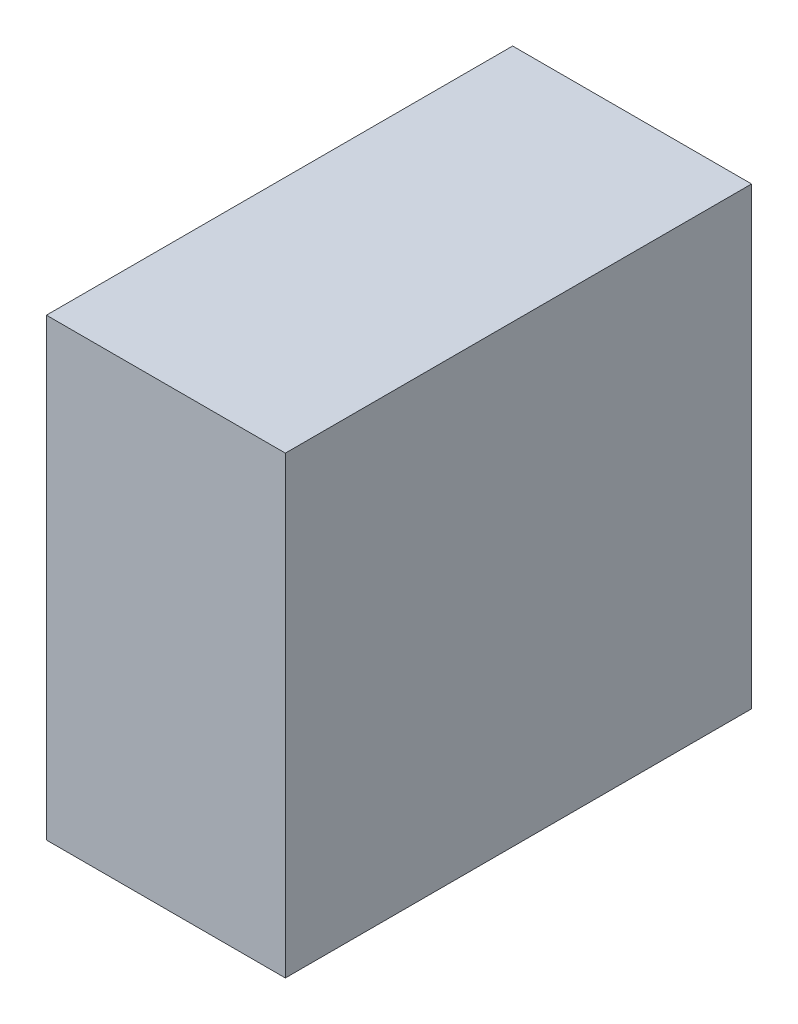
ISO-10303-21;
HEADER;
FILE_DESCRIPTION(('STEP AP214'),'2;1');
FILE_NAME('part.step','',(''),(''),'','','');
FILE_SCHEMA(('AUTOMOTIVE_DESIGN { 1 0 10303 214 1 1 1 1 }'));
ENDSEC;
DATA;
#1=APPLICATION_CONTEXT('core data for automotive mechanical design processes');
#2=APPLICATION_PROTOCOL_DEFINITION('international standard','automotive_design',2000,#1);
#3=PRODUCT_CONTEXT('',#1,'mechanical');
#4=PRODUCT('Part','Part','',(#3));
#5=PRODUCT_RELATED_PRODUCT_CATEGORY('part','',(#4));
#6=PRODUCT_DEFINITION_FORMATION('','',#4);
#7=PRODUCT_DEFINITION_CONTEXT('part definition',#1,'design');
#8=PRODUCT_DEFINITION('design','',#6,#7);
#9=PRODUCT_DEFINITION_SHAPE('','',#8);
#10=(LENGTH_UNIT() NAMED_UNIT(*) SI_UNIT(.MILLI.,.METRE.));
#11=(NAMED_UNIT(*) PLANE_ANGLE_UNIT() SI_UNIT($,.RADIAN.));
#12=(NAMED_UNIT(*) SI_UNIT($,.STERADIAN.) SOLID_ANGLE_UNIT());
#13=UNCERTAINTY_MEASURE_WITH_UNIT(LENGTH_MEASURE(1.E-05),#10,'distance_accuracy_value','');
#14=(GEOMETRIC_REPRESENTATION_CONTEXT(3) GLOBAL_UNCERTAINTY_ASSIGNED_CONTEXT((#13)) GLOBAL_UNIT_ASSIGNED_CONTEXT((#10,
#11,#12)) REPRESENTATION_CONTEXT('',''));
#15=CARTESIAN_POINT('',(0.,0.,0.));
#16=DIRECTION('',(0.,0.,1.));
#17=DIRECTION('',(1.,0.,0.));
#18=AXIS2_PLACEMENT_3D('',#15,#16,#17);
#19=CARTESIAN_POINT('',(-4.1,-7.8,16.));
#20=DIRECTION('',(0.,0.,1.));
#21=DIRECTION('',(1.,0.,0.));
#22=AXIS2_PLACEMENT_3D('',#19,#20,#21);
#23=PLANE('',#22);
#24=DIRECTION('',(0.,1.,0.));
#25=VECTOR('',#24,1.);
#26=CARTESIAN_POINT('',(-4.1,-7.8,16.));
#27=LINE('',#26,#25);
#28=CARTESIAN_POINT('',(-4.1,-7.8,16.));
#29=VERTEX_POINT('',#28);
#30=CARTESIAN_POINT('',(-4.1,7.8,16.));
#31=VERTEX_POINT('',#30);
#32=EDGE_CURVE('E89',#29,#31,#27,.T.);
#33=ORIENTED_EDGE('',*,*,#32,.F.);
#34=DIRECTION('',(1.,0.,0.));
#35=VECTOR('',#34,1.);
#36=CARTESIAN_POINT('',(-4.1,-7.8,16.));
#37=LINE('',#36,#35);
#38=CARTESIAN_POINT('',(4.1,-7.8,16.));
#39=VERTEX_POINT('',#38);
#40=EDGE_CURVE('E71',#29,#39,#37,.T.);
#41=ORIENTED_EDGE('',*,*,#40,.T.);
#42=DIRECTION('',(0.,1.,0.));
#43=VECTOR('',#42,1.);
#44=CARTESIAN_POINT('',(4.1,-7.8,16.));
#45=LINE('',#44,#43);
#46=CARTESIAN_POINT('',(4.1,7.8,16.));
#47=VERTEX_POINT('',#46);
#48=EDGE_CURVE('E83',#39,#47,#45,.T.);
#49=ORIENTED_EDGE('',*,*,#48,.T.);
#50=DIRECTION('',(1.,0.,0.));
#51=VECTOR('',#50,1.);
#52=CARTESIAN_POINT('',(-4.1,7.8,16.));
#53=LINE('',#52,#51);
#54=EDGE_CURVE('E11',#31,#47,#53,.T.);
#55=ORIENTED_EDGE('',*,*,#54,.F.);
#56=EDGE_LOOP('',(#33,#41,#49,#55));
#57=FACE_BOUND('',#56,.T.);
#58=ADVANCED_FACE('F17',(#57),#23,.T.);
#59=CARTESIAN_POINT('',(-4.1,-7.8,0.));
#60=DIRECTION('',(0.,0.,1.));
#61=DIRECTION('',(1.,0.,0.));
#62=AXIS2_PLACEMENT_3D('',#59,#60,#61);
#63=PLANE('',#62);
#64=DIRECTION('',(1.,0.,0.));
#65=VECTOR('',#64,1.);
#66=CARTESIAN_POINT('',(-4.1,7.8,0.));
#67=LINE('',#66,#65);
#68=CARTESIAN_POINT('',(-4.1,7.8,0.));
#69=VERTEX_POINT('',#68);
#70=CARTESIAN_POINT('',(4.1,7.8,0.));
#71=VERTEX_POINT('',#70);
#72=EDGE_CURVE('E26',#69,#71,#67,.T.);
#73=ORIENTED_EDGE('',*,*,#72,.T.);
#74=DIRECTION('',(0.,1.,0.));
#75=VECTOR('',#74,1.);
#76=CARTESIAN_POINT('',(4.1,-7.8,0.));
#77=LINE('',#76,#75);
#78=CARTESIAN_POINT('',(4.1,-7.8,0.));
#79=VERTEX_POINT('',#78);
#80=EDGE_CURVE('E106',#79,#71,#77,.T.);
#81=ORIENTED_EDGE('',*,*,#80,.F.);
#82=DIRECTION('',(1.,0.,0.));
#83=VECTOR('',#82,1.);
#84=CARTESIAN_POINT('',(-4.1,-7.8,0.));
#85=LINE('',#84,#83);
#86=CARTESIAN_POINT('',(-4.1,-7.8,0.));
#87=VERTEX_POINT('',#86);
#88=EDGE_CURVE('E82',#87,#79,#85,.T.);
#89=ORIENTED_EDGE('',*,*,#88,.F.);
#90=DIRECTION('',(0.,1.,0.));
#91=VECTOR('',#90,1.);
#92=CARTESIAN_POINT('',(-4.1,-7.8,0.));
#93=LINE('',#92,#91);
#94=EDGE_CURVE('E90',#87,#69,#93,.T.);
#95=ORIENTED_EDGE('',*,*,#94,.T.);
#96=EDGE_LOOP('',(#73,#81,#89,#95));
#97=FACE_BOUND('',#96,.T.);
#98=ADVANCED_FACE('F19',(#97),#63,.F.);
#99=CARTESIAN_POINT('',(-4.1,7.8,0.));
#100=DIRECTION('',(0.,1.,0.));
#101=DIRECTION('',(1.,0.,0.));
#102=AXIS2_PLACEMENT_3D('',#99,#100,#101);
#103=PLANE('',#102);
#104=ORIENTED_EDGE('',*,*,#72,.F.);
#105=DIRECTION('',(0.,0.,1.));
#106=VECTOR('',#105,1.);
#107=CARTESIAN_POINT('',(-4.1,7.8,0.));
#108=LINE('',#107,#106);
#109=EDGE_CURVE('E94',#69,#31,#108,.T.);
#110=ORIENTED_EDGE('',*,*,#109,.T.);
#111=ORIENTED_EDGE('',*,*,#54,.T.);
#112=DIRECTION('',(0.,0.,1.));
#113=VECTOR('',#112,1.);
#114=CARTESIAN_POINT('',(4.1,7.8,0.));
#115=LINE('',#114,#113);
#116=EDGE_CURVE('E110',#71,#47,#115,.T.);
#117=ORIENTED_EDGE('',*,*,#116,.F.);
#118=EDGE_LOOP('',(#104,#110,#111,#117));
#119=FACE_BOUND('',#118,.T.);
#120=ADVANCED_FACE('F151',(#119),#103,.T.);
#121=CARTESIAN_POINT('',(-4.1,-7.8,0.));
#122=DIRECTION('',(0.,1.,0.));
#123=DIRECTION('',(1.,0.,0.));
#124=AXIS2_PLACEMENT_3D('',#121,#122,#123);
#125=PLANE('',#124);
#126=DIRECTION('',(0.,0.,1.));
#127=VECTOR('',#126,1.);
#128=CARTESIAN_POINT('',(4.1,-7.8,0.));
#129=LINE('',#128,#127);
#130=EDGE_CURVE('E77',#79,#39,#129,.T.);
#131=ORIENTED_EDGE('',*,*,#130,.T.);
#132=ORIENTED_EDGE('',*,*,#40,.F.);
#133=DIRECTION('',(0.,0.,1.));
#134=VECTOR('',#133,1.);
#135=CARTESIAN_POINT('',(-4.1,-7.8,0.));
#136=LINE('',#135,#134);
#137=EDGE_CURVE('E74',#87,#29,#136,.T.);
#138=ORIENTED_EDGE('',*,*,#137,.F.);
#139=ORIENTED_EDGE('',*,*,#88,.T.);
#140=EDGE_LOOP('',(#131,#132,#138,#139));
#141=FACE_BOUND('',#140,.T.);
#142=ADVANCED_FACE('F73',(#141),#125,.F.);
#143=CARTESIAN_POINT('',(4.1,-7.8,0.));
#144=DIRECTION('',(1.,0.,0.));
#145=DIRECTION('',(0.,1.,0.));
#146=AXIS2_PLACEMENT_3D('',#143,#144,#145);
#147=PLANE('',#146);
#148=ORIENTED_EDGE('',*,*,#130,.F.);
#149=ORIENTED_EDGE('',*,*,#80,.T.);
#150=ORIENTED_EDGE('',*,*,#116,.T.);
#151=ORIENTED_EDGE('',*,*,#48,.F.);
#152=EDGE_LOOP('',(#148,#149,#150,#151));
#153=FACE_BOUND('',#152,.T.);
#154=ADVANCED_FACE('F126',(#153),#147,.T.);
#155=CARTESIAN_POINT('',(-4.1,-7.8,0.));
#156=DIRECTION('',(1.,0.,0.));
#157=DIRECTION('',(0.,1.,0.));
#158=AXIS2_PLACEMENT_3D('',#155,#156,#157);
#159=PLANE('',#158);
#160=ORIENTED_EDGE('',*,*,#32,.T.);
#161=ORIENTED_EDGE('',*,*,#109,.F.);
#162=ORIENTED_EDGE('',*,*,#94,.F.);
#163=ORIENTED_EDGE('',*,*,#137,.T.);
#164=EDGE_LOOP('',(#160,#161,#162,#163));
#165=FACE_BOUND('',#164,.T.);
#166=ADVANCED_FACE('F87',(#165),#159,.F.);
#167=CLOSED_SHELL('',(#58,#98,#120,#142,#154,#166));
#168=MANIFOLD_SOLID_BREP('B1',#167);
#169=ADVANCED_BREP_SHAPE_REPRESENTATION('',(#18,#168),#14);
#170=SHAPE_DEFINITION_REPRESENTATION(#9,#169);
ENDSEC;
END-ISO-10303-21;
